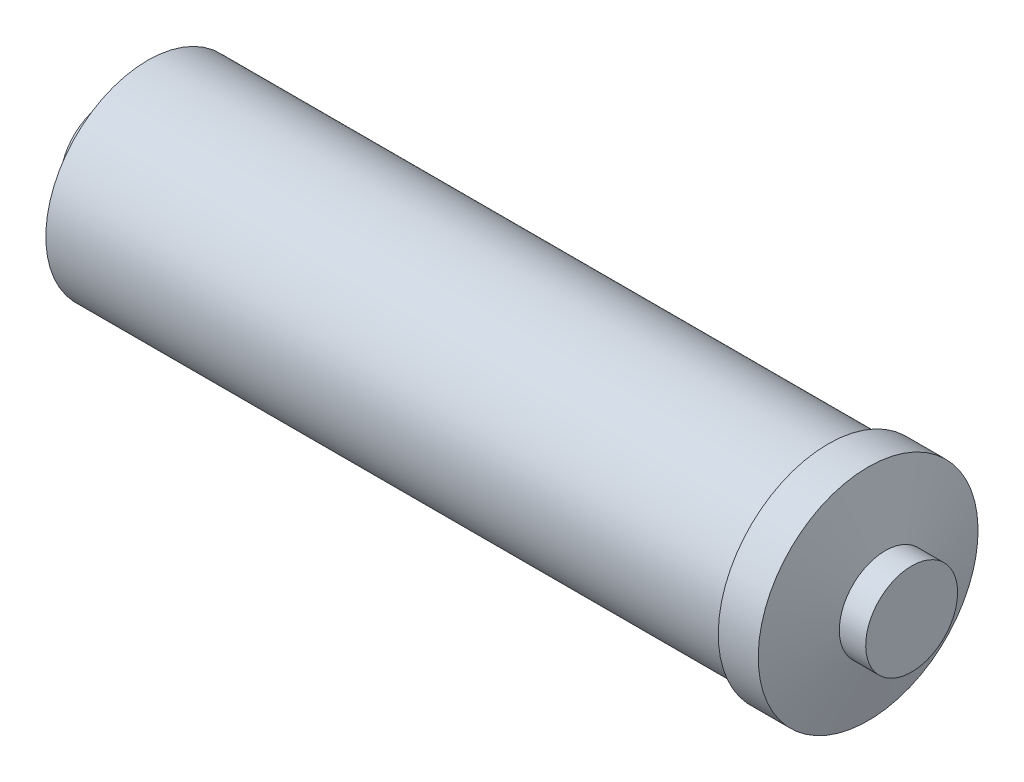
ISO-10303-21;
HEADER;
FILE_DESCRIPTION(('STEP AP214'),'2;1');
FILE_NAME('part.step','',(''),(''),'','','');
FILE_SCHEMA(('AUTOMOTIVE_DESIGN { 1 0 10303 214 1 1 1 1 }'));
ENDSEC;
DATA;
#1=APPLICATION_CONTEXT('core data for automotive mechanical design processes');
#2=APPLICATION_PROTOCOL_DEFINITION('international standard','automotive_design',2000,#1);
#3=PRODUCT_CONTEXT('',#1,'mechanical');
#4=PRODUCT('Part','Part','',(#3));
#5=PRODUCT_RELATED_PRODUCT_CATEGORY('part','',(#4));
#6=PRODUCT_DEFINITION_FORMATION('','',#4);
#7=PRODUCT_DEFINITION_CONTEXT('part definition',#1,'design');
#8=PRODUCT_DEFINITION('design','',#6,#7);
#9=PRODUCT_DEFINITION_SHAPE('','',#8);
#10=(LENGTH_UNIT() NAMED_UNIT(*) SI_UNIT(.MILLI.,.METRE.));
#11=(NAMED_UNIT(*) PLANE_ANGLE_UNIT() SI_UNIT($,.RADIAN.));
#12=(NAMED_UNIT(*) SI_UNIT($,.STERADIAN.) SOLID_ANGLE_UNIT());
#13=UNCERTAINTY_MEASURE_WITH_UNIT(LENGTH_MEASURE(1.E-05),#10,'distance_accuracy_value','');
#14=(GEOMETRIC_REPRESENTATION_CONTEXT(3) GLOBAL_UNCERTAINTY_ASSIGNED_CONTEXT((#13)) GLOBAL_UNIT_ASSIGNED_CONTEXT((#10,
#11,#12)) REPRESENTATION_CONTEXT('',''));
#15=CARTESIAN_POINT('',(0.,0.,0.));
#16=DIRECTION('',(0.,0.,1.));
#17=DIRECTION('',(1.,0.,0.));
#18=AXIS2_PLACEMENT_3D('',#15,#16,#17);
#19=CARTESIAN_POINT('',(0.,14.605,0.));
#20=DIRECTION('',(1.,0.,0.));
#21=DIRECTION('',(0.,1.,0.));
#22=AXIS2_PLACEMENT_3D('',#19,#20,#21);
#23=PLANE('',#22);
#24=CARTESIAN_POINT('',(0.,0.,0.));
#25=DIRECTION('',(1.,0.,0.));
#26=DIRECTION('',(0.,1.,0.));
#27=AXIS2_PLACEMENT_3D('',#24,#25,#26);
#28=CIRCLE('',#27,14.605);
#29=CARTESIAN_POINT('',(0.,14.605,0.));
#30=VERTEX_POINT('',#29);
#31=EDGE_CURVE('E78',#30,#30,#28,.T.);
#32=ORIENTED_EDGE('',*,*,#31,.T.);
#33=EDGE_LOOP('',(#32));
#34=FACE_BOUND('',#33,.T.);
#35=ADVANCED_FACE('F43',(#34),#23,.T.);
#36=CARTESIAN_POINT('',(-255.905,0.,0.));
#37=DIRECTION('',(-1.,0.,0.));
#38=DIRECTION('',(0.,-1.,0.));
#39=AXIS2_PLACEMENT_3D('',#36,#37,#38);
#40=PLANE('',#39);
#41=CARTESIAN_POINT('',(-255.905,0.,0.));
#42=DIRECTION('',(1.,0.,0.));
#43=DIRECTION('',(0.,1.,0.));
#44=AXIS2_PLACEMENT_3D('',#41,#42,#43);
#45=CIRCLE('',#44,14.605);
#46=CARTESIAN_POINT('',(-255.905,14.605,0.));
#47=VERTEX_POINT('',#46);
#48=EDGE_CURVE('E10',#47,#47,#45,.T.);
#49=ORIENTED_EDGE('',*,*,#48,.F.);
#50=EDGE_LOOP('',(#49));
#51=FACE_BOUND('',#50,.T.);
#52=ADVANCED_FACE('F96',(#51),#40,.T.);
#53=CARTESIAN_POINT('',(0.,0.,0.));
#54=DIRECTION('',(1.,0.,0.));
#55=DIRECTION('',(0.,1.,0.));
#56=AXIS2_PLACEMENT_3D('',#53,#54,#55);
#57=CYLINDRICAL_SURFACE('',#56,14.605);
#58=ORIENTED_EDGE('',*,*,#48,.T.);
#59=EDGE_LOOP('',(#58));
#60=FACE_BOUND('',#59,.T.);
#61=CARTESIAN_POINT('',(-247.523,0.,0.));
#62=DIRECTION('',(1.,0.,0.));
#63=DIRECTION('',(0.,1.,0.));
#64=AXIS2_PLACEMENT_3D('',#61,#62,#63);
#65=CIRCLE('',#64,14.605);
#66=CARTESIAN_POINT('',(-247.523,14.605,0.));
#67=VERTEX_POINT('',#66);
#68=EDGE_CURVE('E50',#67,#67,#65,.T.);
#69=ORIENTED_EDGE('',*,*,#68,.F.);
#70=EDGE_LOOP('',(#69));
#71=FACE_BOUND('',#70,.T.);
#72=ADVANCED_FACE('F100',(#60,#71),#57,.T.);
#73=CARTESIAN_POINT('',(-242.758863358575,0.,0.));
#74=DIRECTION('',(1.,0.,0.));
#75=DIRECTION('',(0.,1.,0.));
#76=AXIS2_PLACEMENT_3D('',#73,#74,#75);
#77=CONICAL_SURFACE('',#76,32.385,1.30899693899575);
#78=ORIENTED_EDGE('',*,*,#68,.T.);
#79=EDGE_LOOP('',(#78));
#80=FACE_BOUND('',#79,.T.);
#81=CARTESIAN_POINT('',(-242.758863358575,0.,0.));
#82=DIRECTION('',(1.,0.,0.));
#83=DIRECTION('',(0.,1.,0.));
#84=AXIS2_PLACEMENT_3D('',#81,#82,#83);
#85=CIRCLE('',#84,32.385);
#86=CARTESIAN_POINT('',(-242.758863358575,32.385,0.));
#87=VERTEX_POINT('',#86);
#88=EDGE_CURVE('E55',#87,#87,#85,.T.);
#89=ORIENTED_EDGE('',*,*,#88,.F.);
#90=EDGE_LOOP('',(#89));
#91=FACE_BOUND('',#90,.T.);
#92=ADVANCED_FACE('F105',(#80,#91),#77,.T.);
#93=CARTESIAN_POINT('',(0.,0.,0.));
#94=DIRECTION('',(1.,0.,0.));
#95=DIRECTION('',(0.,1.,0.));
#96=AXIS2_PLACEMENT_3D('',#93,#94,#95);
#97=CYLINDRICAL_SURFACE('',#96,32.385);
#98=ORIENTED_EDGE('',*,*,#88,.T.);
#99=EDGE_LOOP('',(#98));
#100=FACE_BOUND('',#99,.T.);
#101=CARTESIAN_POINT('',(-27.2073185389754,0.,0.));
#102=DIRECTION('',(1.,0.,0.));
#103=DIRECTION('',(0.,1.,0.));
#104=AXIS2_PLACEMENT_3D('',#101,#102,#103);
#105=CIRCLE('',#104,32.385);
#106=CARTESIAN_POINT('',(-27.2073185389754,32.385,0.));
#107=VERTEX_POINT('',#106);
#108=EDGE_CURVE('E60',#107,#107,#105,.T.);
#109=ORIENTED_EDGE('',*,*,#108,.F.);
#110=EDGE_LOOP('',(#109));
#111=FACE_BOUND('',#110,.T.);
#112=ADVANCED_FACE('F110',(#100,#111),#97,.T.);
#113=CARTESIAN_POINT('',(-26.5267275902004,0.,0.));
#114=DIRECTION('',(1.,0.,0.));
#115=DIRECTION('',(0.,1.,0.));
#116=AXIS2_PLACEMENT_3D('',#113,#114,#115);
#117=CONICAL_SURFACE('',#116,34.925,1.30899693899575);
#118=ORIENTED_EDGE('',*,*,#108,.T.);
#119=EDGE_LOOP('',(#118));
#120=FACE_BOUND('',#119,.T.);
#121=CARTESIAN_POINT('',(-26.5267275902004,0.,0.));
#122=DIRECTION('',(1.,0.,0.));
#123=DIRECTION('',(0.,1.,0.));
#124=AXIS2_PLACEMENT_3D('',#121,#122,#123);
#125=CIRCLE('',#124,34.925);
#126=CARTESIAN_POINT('',(-26.5267275902004,34.925,0.));
#127=VERTEX_POINT('',#126);
#128=EDGE_CURVE('E66',#127,#127,#125,.T.);
#129=ORIENTED_EDGE('',*,*,#128,.F.);
#130=EDGE_LOOP('',(#129));
#131=FACE_BOUND('',#130,.T.);
#132=ADVANCED_FACE('F113',(#120,#131),#117,.T.);
#133=CARTESIAN_POINT('',(0.,0.,0.));
#134=DIRECTION('',(1.,0.,0.));
#135=DIRECTION('',(0.,1.,0.));
#136=AXIS2_PLACEMENT_3D('',#133,#134,#135);
#137=CYLINDRICAL_SURFACE('',#136,34.925);
#138=ORIENTED_EDGE('',*,*,#128,.T.);
#139=EDGE_LOOP('',(#138));
#140=FACE_BOUND('',#139,.T.);
#141=CARTESIAN_POINT('',(-13.8267275902003,0.,0.));
#142=DIRECTION('',(1.,0.,0.));
#143=DIRECTION('',(0.,1.,0.));
#144=AXIS2_PLACEMENT_3D('',#141,#142,#143);
#145=CIRCLE('',#144,34.925);
#146=CARTESIAN_POINT('',(-13.8267275902004,34.925,0.));
#147=VERTEX_POINT('',#146);
#148=EDGE_CURVE('E70',#147,#147,#145,.T.);
#149=ORIENTED_EDGE('',*,*,#148,.F.);
#150=EDGE_LOOP('',(#149));
#151=FACE_BOUND('',#150,.T.);
#152=ADVANCED_FACE('F92',(#140,#151),#137,.T.);
#153=CARTESIAN_POINT('',(-8.382,0.,0.));
#154=DIRECTION('',(-1.,0.,0.));
#155=DIRECTION('',(0.,-1.,0.));
#156=AXIS2_PLACEMENT_3D('',#153,#154,#155);
#157=CONICAL_SURFACE('',#156,14.605,1.30899693899575);
#158=ORIENTED_EDGE('',*,*,#148,.T.);
#159=EDGE_LOOP('',(#158));
#160=FACE_BOUND('',#159,.T.);
#161=CARTESIAN_POINT('',(-8.382,0.,0.));
#162=DIRECTION('',(1.,0.,0.));
#163=DIRECTION('',(0.,1.,0.));
#164=AXIS2_PLACEMENT_3D('',#161,#162,#163);
#165=CIRCLE('',#164,14.605);
#166=CARTESIAN_POINT('',(-8.382,14.605,0.));
#167=VERTEX_POINT('',#166);
#168=EDGE_CURVE('E74',#167,#167,#165,.T.);
#169=ORIENTED_EDGE('',*,*,#168,.F.);
#170=EDGE_LOOP('',(#169));
#171=FACE_BOUND('',#170,.T.);
#172=ADVANCED_FACE('F86',(#160,#171),#157,.T.);
#173=CARTESIAN_POINT('',(0.,0.,0.));
#174=DIRECTION('',(1.,0.,0.));
#175=DIRECTION('',(0.,1.,0.));
#176=AXIS2_PLACEMENT_3D('',#173,#174,#175);
#177=CYLINDRICAL_SURFACE('',#176,14.605);
#178=ORIENTED_EDGE('',*,*,#168,.T.);
#179=EDGE_LOOP('',(#178));
#180=FACE_BOUND('',#179,.T.);
#181=ORIENTED_EDGE('',*,*,#31,.F.);
#182=EDGE_LOOP('',(#181));
#183=FACE_BOUND('',#182,.T.);
#184=ADVANCED_FACE('F84',(#180,#183),#177,.T.);
#185=CLOSED_SHELL('',(#35,#52,#72,#92,#112,#132,#152,#172,#184));
#186=MANIFOLD_SOLID_BREP('B2',#185);
#187=ADVANCED_BREP_SHAPE_REPRESENTATION('',(#18,#186),#14);
#188=SHAPE_DEFINITION_REPRESENTATION(#9,#187);
ENDSEC;
END-ISO-10303-21;
